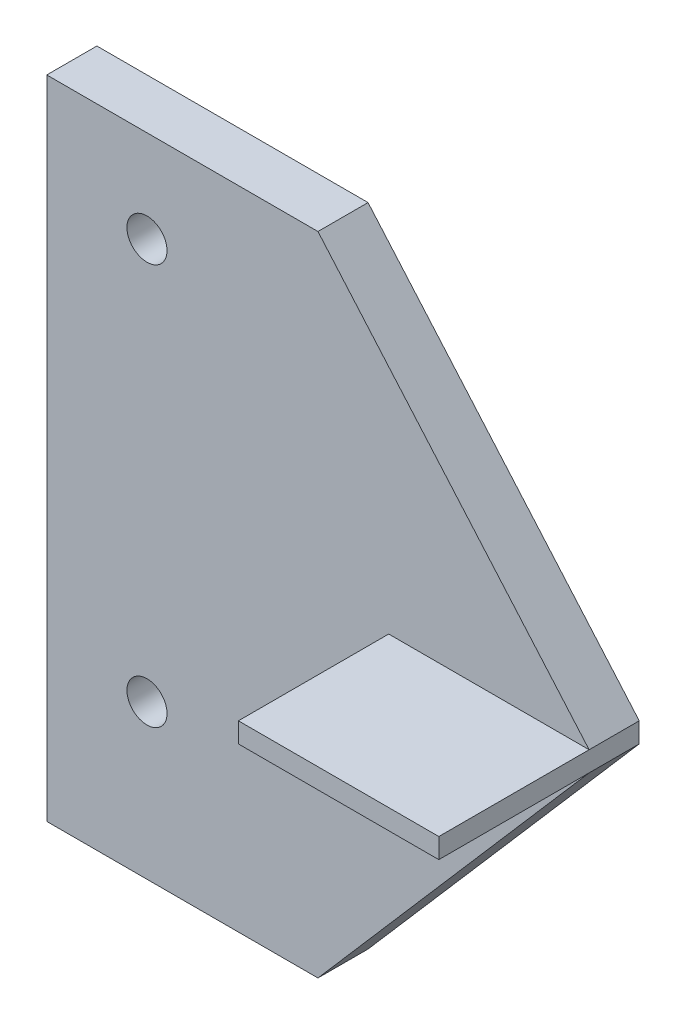
ISO-10303-21;
HEADER;
FILE_DESCRIPTION(('STEP AP214'),'2;1');
FILE_NAME('part.step','',(''),(''),'','','');
FILE_SCHEMA(('AUTOMOTIVE_DESIGN { 1 0 10303 214 1 1 1 1 }'));
ENDSEC;
DATA;
#1=APPLICATION_CONTEXT('core data for automotive mechanical design processes');
#2=APPLICATION_PROTOCOL_DEFINITION('international standard','automotive_design',2000,#1);
#3=PRODUCT_CONTEXT('',#1,'mechanical');
#4=PRODUCT('Part','Part','',(#3));
#5=PRODUCT_RELATED_PRODUCT_CATEGORY('part','',(#4));
#6=PRODUCT_DEFINITION_FORMATION('','',#4);
#7=PRODUCT_DEFINITION_CONTEXT('part definition',#1,'design');
#8=PRODUCT_DEFINITION('design','',#6,#7);
#9=PRODUCT_DEFINITION_SHAPE('','',#8);
#10=(LENGTH_UNIT() NAMED_UNIT(*) SI_UNIT(.MILLI.,.METRE.));
#11=(NAMED_UNIT(*) PLANE_ANGLE_UNIT() SI_UNIT($,.RADIAN.));
#12=(NAMED_UNIT(*) SI_UNIT($,.STERADIAN.) SOLID_ANGLE_UNIT());
#13=UNCERTAINTY_MEASURE_WITH_UNIT(LENGTH_MEASURE(1.E-05),#10,'distance_accuracy_value','');
#14=(GEOMETRIC_REPRESENTATION_CONTEXT(3) GLOBAL_UNCERTAINTY_ASSIGNED_CONTEXT((#13)) GLOBAL_UNIT_ASSIGNED_CONTEXT((#10,
#11,#12)) REPRESENTATION_CONTEXT('',''));
#15=CARTESIAN_POINT('',(0.,0.,0.));
#16=DIRECTION('',(0.,0.,1.));
#17=DIRECTION('',(1.,0.,0.));
#18=AXIS2_PLACEMENT_3D('',#15,#16,#17);
#19=CARTESIAN_POINT('',(0.,0.,5.));
#20=DIRECTION('',(0.,0.,1.));
#21=DIRECTION('',(1.,0.,0.));
#22=AXIS2_PLACEMENT_3D('',#19,#20,#21);
#23=PLANE('',#22);
#24=CARTESIAN_POINT('',(-310.2,-180.,5.));
#25=DIRECTION('',(0.,0.,1.));
#26=DIRECTION('',(1.,0.,0.));
#27=AXIS2_PLACEMENT_3D('',#24,#25,#26);
#28=CIRCLE('',#27,2.);
#29=CARTESIAN_POINT('',(-308.2,-180.,5.));
#30=VERTEX_POINT('',#29);
#31=EDGE_CURVE('E146',#30,#30,#28,.T.);
#32=ORIENTED_EDGE('',*,*,#31,.F.);
#33=EDGE_LOOP('',(#32));
#34=FACE_BOUND('',#33,.T.);
#35=CARTESIAN_POINT('',(-310.2,-220.,5.));
#36=DIRECTION('',(0.,0.,1.));
#37=DIRECTION('',(1.,0.,0.));
#38=AXIS2_PLACEMENT_3D('',#35,#36,#37);
#39=CIRCLE('',#38,2.);
#40=CARTESIAN_POINT('',(-308.2,-220.,5.));
#41=VERTEX_POINT('',#40);
#42=EDGE_CURVE('E225',#41,#41,#39,.T.);
#43=ORIENTED_EDGE('',*,*,#42,.F.);
#44=EDGE_LOOP('',(#43));
#45=FACE_BOUND('',#44,.T.);
#46=DIRECTION('',(1.,0.,0.));
#47=VECTOR('',#46,1.);
#48=CARTESIAN_POINT('',(-320.2,-235.332908159876,5.));
#49=LINE('',#48,#47);
#50=CARTESIAN_POINT('',(-320.2,-235.332908159876,5.));
#51=VERTEX_POINT('',#50);
#52=CARTESIAN_POINT('',(-293.137631361917,-235.332908159876,5.));
#53=VERTEX_POINT('',#52);
#54=EDGE_CURVE('E123',#51,#53,#49,.T.);
#55=ORIENTED_EDGE('',*,*,#54,.T.);
#56=DIRECTION('',(0.654522827141133,0.756042240057511,0.));
#57=VECTOR('',#56,1.);
#58=CARTESIAN_POINT('',(-51.1036705060079,44.2416006998985,5.));
#59=LINE('',#58,#57);
#60=CARTESIAN_POINT('',(-266.075262723834,-204.07304531328,5.));
#61=VERTEX_POINT('',#60);
#62=EDGE_CURVE('E109',#53,#61,#59,.T.);
#63=ORIENTED_EDGE('',*,*,#62,.T.);
#64=DIRECTION('',(1.,0.,0.));
#65=VECTOR('',#64,1.);
#66=CARTESIAN_POINT('',(0.,-204.07304531328,5.));
#67=LINE('',#66,#65);
#68=CARTESIAN_POINT('',(-286.075262723834,-204.07304531328,5.));
#69=VERTEX_POINT('',#68);
#70=EDGE_CURVE('E218',#69,#61,#67,.T.);
#71=ORIENTED_EDGE('',*,*,#70,.F.);
#72=DIRECTION('',(0.,1.,0.));
#73=VECTOR('',#72,1.);
#74=CARTESIAN_POINT('',(-286.075262723834,0.,5.));
#75=LINE('',#74,#73);
#76=CARTESIAN_POINT('',(-286.075262723834,-202.07304531328,5.));
#77=VERTEX_POINT('',#76);
#78=EDGE_CURVE('E221',#69,#77,#75,.T.);
#79=ORIENTED_EDGE('',*,*,#78,.T.);
#80=DIRECTION('',(-1.,0.,0.));
#81=VECTOR('',#80,1.);
#82=CARTESIAN_POINT('',(0.,-202.07304531328,5.));
#83=LINE('',#82,#81);
#84=CARTESIAN_POINT('',(-266.075262723834,-202.07304531328,5.));
#85=VERTEX_POINT('',#84);
#86=EDGE_CURVE('E171',#85,#77,#83,.T.);
#87=ORIENTED_EDGE('',*,*,#86,.F.);
#88=DIRECTION('',(-0.654522827141133,0.75604224005751,0.));
#89=VECTOR('',#88,1.);
#90=CARTESIAN_POINT('',(-252.083806186949,-218.234639230512,5.));
#91=LINE('',#90,#89);
#92=CARTESIAN_POINT('',(-293.137631361917,-170.813182466683,5.));
#93=VERTEX_POINT('',#92);
#94=EDGE_CURVE('E163',#85,#93,#91,.T.);
#95=ORIENTED_EDGE('',*,*,#94,.T.);
#96=DIRECTION('',(-1.,0.,0.));
#97=VECTOR('',#96,1.);
#98=CARTESIAN_POINT('',(-320.2,-170.813182466683,5.));
#99=LINE('',#98,#97);
#100=CARTESIAN_POINT('',(-320.2,-170.813182466683,5.));
#101=VERTEX_POINT('',#100);
#102=EDGE_CURVE('E132',#93,#101,#99,.T.);
#103=ORIENTED_EDGE('',*,*,#102,.T.);
#104=DIRECTION('',(0.,-1.,0.));
#105=VECTOR('',#104,1.);
#106=CARTESIAN_POINT('',(-320.2,-170.813182466683,5.));
#107=LINE('',#106,#105);
#108=EDGE_CURVE('E129',#101,#51,#107,.T.);
#109=ORIENTED_EDGE('',*,*,#108,.T.);
#110=EDGE_LOOP('',(#55,#63,#71,#79,#87,#95,#103,#109));
#111=FACE_BOUND('',#110,.T.);
#112=ADVANCED_FACE('F40',(#34,#45,#111),#23,.T.);
#113=CARTESIAN_POINT('',(0.,0.,0.));
#114=DIRECTION('',(0.,0.,1.));
#115=DIRECTION('',(1.,0.,0.));
#116=AXIS2_PLACEMENT_3D('',#113,#114,#115);
#117=PLANE('',#116);
#118=CARTESIAN_POINT('',(-310.2,-180.,0.));
#119=DIRECTION('',(0.,0.,1.));
#120=DIRECTION('',(1.,0.,0.));
#121=AXIS2_PLACEMENT_3D('',#118,#119,#120);
#122=CIRCLE('',#121,2.);
#123=CARTESIAN_POINT('',(-308.2,-180.,0.));
#124=VERTEX_POINT('',#123);
#125=EDGE_CURVE('E229',#124,#124,#122,.T.);
#126=ORIENTED_EDGE('',*,*,#125,.T.);
#127=EDGE_LOOP('',(#126));
#128=FACE_BOUND('',#127,.T.);
#129=CARTESIAN_POINT('',(-310.2,-220.,0.));
#130=DIRECTION('',(0.,0.,1.));
#131=DIRECTION('',(1.,0.,0.));
#132=AXIS2_PLACEMENT_3D('',#129,#130,#131);
#133=CIRCLE('',#132,2.);
#134=CARTESIAN_POINT('',(-308.2,-220.,0.));
#135=VERTEX_POINT('',#134);
#136=EDGE_CURVE('E224',#135,#135,#133,.T.);
#137=ORIENTED_EDGE('',*,*,#136,.T.);
#138=EDGE_LOOP('',(#137));
#139=FACE_BOUND('',#138,.T.);
#140=DIRECTION('',(0.654522827141133,0.756042240057511,0.));
#141=VECTOR('',#140,1.);
#142=CARTESIAN_POINT('',(-51.1036705060079,44.2416006998985,0.));
#143=LINE('',#142,#141);
#144=CARTESIAN_POINT('',(-293.137631361917,-235.332908159876,0.));
#145=VERTEX_POINT('',#144);
#146=CARTESIAN_POINT('',(-266.075262723834,-204.07304531328,0.));
#147=VERTEX_POINT('',#146);
#148=EDGE_CURVE('E55',#145,#147,#143,.T.);
#149=ORIENTED_EDGE('',*,*,#148,.F.);
#150=DIRECTION('',(1.,0.,0.));
#151=VECTOR('',#150,1.);
#152=CARTESIAN_POINT('',(-320.2,-235.332908159876,0.));
#153=LINE('',#152,#151);
#154=CARTESIAN_POINT('',(-320.2,-235.332908159876,0.));
#155=VERTEX_POINT('',#154);
#156=EDGE_CURVE('E125',#155,#145,#153,.T.);
#157=ORIENTED_EDGE('',*,*,#156,.F.);
#158=DIRECTION('',(0.,-1.,0.));
#159=VECTOR('',#158,1.);
#160=CARTESIAN_POINT('',(-320.2,-170.813182466683,0.));
#161=LINE('',#160,#159);
#162=CARTESIAN_POINT('',(-320.2,-170.813182466683,0.));
#163=VERTEX_POINT('',#162);
#164=EDGE_CURVE('E142',#163,#155,#161,.T.);
#165=ORIENTED_EDGE('',*,*,#164,.F.);
#166=DIRECTION('',(-1.,0.,0.));
#167=VECTOR('',#166,1.);
#168=CARTESIAN_POINT('',(-320.2,-170.813182466683,0.));
#169=LINE('',#168,#167);
#170=CARTESIAN_POINT('',(-293.137631361917,-170.813182466683,0.));
#171=VERTEX_POINT('',#170);
#172=EDGE_CURVE('E138',#171,#163,#169,.T.);
#173=ORIENTED_EDGE('',*,*,#172,.F.);
#174=DIRECTION('',(-0.654522827141133,0.75604224005751,0.));
#175=VECTOR('',#174,1.);
#176=CARTESIAN_POINT('',(-252.083806186949,-218.234639230512,0.));
#177=LINE('',#176,#175);
#178=CARTESIAN_POINT('',(-266.075262723834,-202.07304531328,0.));
#179=VERTEX_POINT('',#178);
#180=EDGE_CURVE('E63',#179,#171,#177,.T.);
#181=ORIENTED_EDGE('',*,*,#180,.F.);
#182=DIRECTION('',(0.,1.,0.));
#183=VECTOR('',#182,1.);
#184=CARTESIAN_POINT('',(-266.075262723834,-170.813182466683,0.));
#185=LINE('',#184,#183);
#186=EDGE_CURVE('E149',#147,#179,#185,.T.);
#187=ORIENTED_EDGE('',*,*,#186,.F.);
#188=EDGE_LOOP('',(#149,#157,#165,#173,#181,#187));
#189=FACE_BOUND('',#188,.T.);
#190=ADVANCED_FACE('F179',(#128,#139,#189),#117,.F.);
#191=CARTESIAN_POINT('',(-320.2,-235.332908159876,5.));
#192=DIRECTION('',(0.,1.,0.));
#193=DIRECTION('',(0.,0.,1.));
#194=AXIS2_PLACEMENT_3D('',#191,#192,#193);
#195=PLANE('',#194);
#196=DIRECTION('',(0.,0.,1.));
#197=VECTOR('',#196,1.);
#198=CARTESIAN_POINT('',(-293.137631361917,-235.332908159876,-2.));
#199=LINE('',#198,#197);
#200=EDGE_CURVE('E112',#145,#53,#199,.T.);
#201=ORIENTED_EDGE('',*,*,#200,.T.);
#202=ORIENTED_EDGE('',*,*,#54,.F.);
#203=DIRECTION('',(0.,0.,-1.));
#204=VECTOR('',#203,1.);
#205=CARTESIAN_POINT('',(-320.2,-235.332908159876,5.));
#206=LINE('',#205,#204);
#207=EDGE_CURVE('E158',#51,#155,#206,.T.);
#208=ORIENTED_EDGE('',*,*,#207,.T.);
#209=ORIENTED_EDGE('',*,*,#156,.T.);
#210=EDGE_LOOP('',(#201,#202,#208,#209));
#211=FACE_BOUND('',#210,.T.);
#212=ADVANCED_FACE('F121',(#211),#195,.F.);
#213=CARTESIAN_POINT('',(-266.075262723834,-170.813182466683,5.));
#214=DIRECTION('',(-1.,0.,0.));
#215=DIRECTION('',(0.,0.,1.));
#216=AXIS2_PLACEMENT_3D('',#213,#214,#215);
#217=PLANE('',#216);
#218=DIRECTION('',(0.,0.,1.));
#219=VECTOR('',#218,1.);
#220=CARTESIAN_POINT('',(-266.075262723834,-204.07304531328,5.));
#221=LINE('',#220,#219);
#222=EDGE_CURVE('E12',#147,#61,#221,.T.);
#223=ORIENTED_EDGE('',*,*,#222,.F.);
#224=ORIENTED_EDGE('',*,*,#186,.T.);
#225=DIRECTION('',(0.,0.,1.));
#226=VECTOR('',#225,1.);
#227=CARTESIAN_POINT('',(-266.075262723834,-202.07304531328,-2.));
#228=LINE('',#227,#226);
#229=EDGE_CURVE('E117',#179,#85,#228,.T.);
#230=ORIENTED_EDGE('',*,*,#229,.T.);
#231=DIRECTION('',(0.,0.,1.));
#232=VECTOR('',#231,1.);
#233=CARTESIAN_POINT('',(-266.075262723834,-202.07304531328,0.));
#234=LINE('',#233,#232);
#235=CARTESIAN_POINT('',(-266.075262723834,-202.07304531328,20.));
#236=VERTEX_POINT('',#235);
#237=EDGE_CURVE('E182',#85,#236,#234,.T.);
#238=ORIENTED_EDGE('',*,*,#237,.T.);
#239=DIRECTION('',(0.,-1.,0.));
#240=VECTOR('',#239,1.);
#241=CARTESIAN_POINT('',(-266.075262723834,-204.07304531328,20.));
#242=LINE('',#241,#240);
#243=CARTESIAN_POINT('',(-266.075262723834,-204.07304531328,20.));
#244=VERTEX_POINT('',#243);
#245=EDGE_CURVE('E186',#236,#244,#242,.T.);
#246=ORIENTED_EDGE('',*,*,#245,.T.);
#247=DIRECTION('',(0.,0.,-1.));
#248=VECTOR('',#247,1.);
#249=CARTESIAN_POINT('',(-266.075262723834,-204.07304531328,0.));
#250=LINE('',#249,#248);
#251=EDGE_CURVE('E195',#244,#61,#250,.T.);
#252=ORIENTED_EDGE('',*,*,#251,.T.);
#253=EDGE_LOOP('',(#223,#224,#230,#238,#246,#252));
#254=FACE_BOUND('',#253,.T.);
#255=ADVANCED_FACE('F265',(#254),#217,.F.);
#256=CARTESIAN_POINT('',(-320.2,-170.813182466683,5.));
#257=DIRECTION('',(0.,-1.,0.));
#258=DIRECTION('',(0.,0.,-1.));
#259=AXIS2_PLACEMENT_3D('',#256,#257,#258);
#260=PLANE('',#259);
#261=DIRECTION('',(0.,0.,1.));
#262=VECTOR('',#261,1.);
#263=CARTESIAN_POINT('',(-293.137631361917,-170.813182466683,5.));
#264=LINE('',#263,#262);
#265=EDGE_CURVE('E49',#171,#93,#264,.T.);
#266=ORIENTED_EDGE('',*,*,#265,.F.);
#267=ORIENTED_EDGE('',*,*,#172,.T.);
#268=DIRECTION('',(0.,0.,-1.));
#269=VECTOR('',#268,1.);
#270=CARTESIAN_POINT('',(-320.2,-170.813182466683,5.));
#271=LINE('',#270,#269);
#272=EDGE_CURVE('E136',#101,#163,#271,.T.);
#273=ORIENTED_EDGE('',*,*,#272,.F.);
#274=ORIENTED_EDGE('',*,*,#102,.F.);
#275=EDGE_LOOP('',(#266,#267,#273,#274));
#276=FACE_BOUND('',#275,.T.);
#277=ADVANCED_FACE('F175',(#276),#260,.F.);
#278=CARTESIAN_POINT('',(-320.2,-170.813182466683,5.));
#279=DIRECTION('',(1.,0.,0.));
#280=DIRECTION('',(0.,0.,-1.));
#281=AXIS2_PLACEMENT_3D('',#278,#279,#280);
#282=PLANE('',#281);
#283=ORIENTED_EDGE('',*,*,#164,.T.);
#284=ORIENTED_EDGE('',*,*,#207,.F.);
#285=ORIENTED_EDGE('',*,*,#108,.F.);
#286=ORIENTED_EDGE('',*,*,#272,.T.);
#287=EDGE_LOOP('',(#283,#284,#285,#286));
#288=FACE_BOUND('',#287,.T.);
#289=ADVANCED_FACE('F42',(#288),#282,.F.);
#290=CARTESIAN_POINT('',(-310.2,-180.,5.));
#291=DIRECTION('',(0.,0.,-1.));
#292=DIRECTION('',(-1.,0.,0.));
#293=AXIS2_PLACEMENT_3D('',#290,#291,#292);
#294=CYLINDRICAL_SURFACE('',#293,2.);
#295=ORIENTED_EDGE('',*,*,#31,.T.);
#296=EDGE_LOOP('',(#295));
#297=FACE_BOUND('',#296,.T.);
#298=ORIENTED_EDGE('',*,*,#125,.F.);
#299=EDGE_LOOP('',(#298));
#300=FACE_BOUND('',#299,.T.);
#301=ADVANCED_FACE('F241',(#297,#300),#294,.F.);
#302=CARTESIAN_POINT('',(-310.2,-220.,5.));
#303=DIRECTION('',(0.,0.,-1.));
#304=DIRECTION('',(-1.,0.,0.));
#305=AXIS2_PLACEMENT_3D('',#302,#303,#304);
#306=CYLINDRICAL_SURFACE('',#305,2.);
#307=ORIENTED_EDGE('',*,*,#42,.T.);
#308=EDGE_LOOP('',(#307));
#309=FACE_BOUND('',#308,.T.);
#310=ORIENTED_EDGE('',*,*,#136,.F.);
#311=EDGE_LOOP('',(#310));
#312=FACE_BOUND('',#311,.T.);
#313=ADVANCED_FACE('F243',(#309,#312),#306,.F.);
#314=CARTESIAN_POINT('',(-286.075262723834,-204.07304531328,0.));
#315=DIRECTION('',(0.,-1.,0.));
#316=DIRECTION('',(0.,0.,-1.));
#317=AXIS2_PLACEMENT_3D('',#314,#315,#316);
#318=PLANE('',#317);
#319=DIRECTION('',(0.,0.,-1.));
#320=VECTOR('',#319,1.);
#321=CARTESIAN_POINT('',(-286.075262723834,-204.07304531328,0.));
#322=LINE('',#321,#320);
#323=CARTESIAN_POINT('',(-286.075262723834,-204.07304531328,20.));
#324=VERTEX_POINT('',#323);
#325=EDGE_CURVE('E199',#324,#69,#322,.T.);
#326=ORIENTED_EDGE('',*,*,#325,.T.);
#327=ORIENTED_EDGE('',*,*,#70,.T.);
#328=ORIENTED_EDGE('',*,*,#251,.F.);
#329=DIRECTION('',(1.,0.,0.));
#330=VECTOR('',#329,1.);
#331=CARTESIAN_POINT('',(-286.075262723834,-204.07304531328,20.));
#332=LINE('',#331,#330);
#333=EDGE_CURVE('E210',#324,#244,#332,.T.);
#334=ORIENTED_EDGE('',*,*,#333,.F.);
#335=EDGE_LOOP('',(#326,#327,#328,#334));
#336=FACE_BOUND('',#335,.T.);
#337=ADVANCED_FACE('F250',(#336),#318,.T.);
#338=CARTESIAN_POINT('',(-286.075262723834,-204.07304531328,20.));
#339=DIRECTION('',(0.,0.,1.));
#340=DIRECTION('',(1.,0.,0.));
#341=AXIS2_PLACEMENT_3D('',#338,#339,#340);
#342=PLANE('',#341);
#343=ORIENTED_EDGE('',*,*,#245,.F.);
#344=DIRECTION('',(1.,0.,0.));
#345=VECTOR('',#344,1.);
#346=CARTESIAN_POINT('',(-286.075262723834,-202.07304531328,20.));
#347=LINE('',#346,#345);
#348=CARTESIAN_POINT('',(-286.075262723834,-202.07304531328,20.));
#349=VERTEX_POINT('',#348);
#350=EDGE_CURVE('E202',#349,#236,#347,.T.);
#351=ORIENTED_EDGE('',*,*,#350,.F.);
#352=DIRECTION('',(0.,-1.,0.));
#353=VECTOR('',#352,1.);
#354=CARTESIAN_POINT('',(-286.075262723834,-204.07304531328,20.));
#355=LINE('',#354,#353);
#356=EDGE_CURVE('E194',#349,#324,#355,.T.);
#357=ORIENTED_EDGE('',*,*,#356,.T.);
#358=ORIENTED_EDGE('',*,*,#333,.T.);
#359=EDGE_LOOP('',(#343,#351,#357,#358));
#360=FACE_BOUND('',#359,.T.);
#361=ADVANCED_FACE('F303',(#360),#342,.T.);
#362=CARTESIAN_POINT('',(-286.075262723834,-202.07304531328,0.));
#363=DIRECTION('',(0.,1.,0.));
#364=DIRECTION('',(0.,0.,1.));
#365=AXIS2_PLACEMENT_3D('',#362,#363,#364);
#366=PLANE('',#365);
#367=ORIENTED_EDGE('',*,*,#237,.F.);
#368=ORIENTED_EDGE('',*,*,#86,.T.);
#369=DIRECTION('',(0.,0.,1.));
#370=VECTOR('',#369,1.);
#371=CARTESIAN_POINT('',(-286.075262723834,-202.07304531328,0.));
#372=LINE('',#371,#370);
#373=EDGE_CURVE('E191',#77,#349,#372,.T.);
#374=ORIENTED_EDGE('',*,*,#373,.T.);
#375=ORIENTED_EDGE('',*,*,#350,.T.);
#376=EDGE_LOOP('',(#367,#368,#374,#375));
#377=FACE_BOUND('',#376,.T.);
#378=ADVANCED_FACE('F308',(#377),#366,.T.);
#379=CARTESIAN_POINT('',(-286.075262723834,0.,0.));
#380=DIRECTION('',(1.,0.,0.));
#381=DIRECTION('',(0.,0.,-1.));
#382=AXIS2_PLACEMENT_3D('',#379,#380,#381);
#383=PLANE('',#382);
#384=ORIENTED_EDGE('',*,*,#78,.F.);
#385=ORIENTED_EDGE('',*,*,#325,.F.);
#386=ORIENTED_EDGE('',*,*,#356,.F.);
#387=ORIENTED_EDGE('',*,*,#373,.F.);
#388=EDGE_LOOP('',(#384,#385,#386,#387));
#389=FACE_BOUND('',#388,.T.);
#390=ADVANCED_FACE('F316',(#389),#383,.F.);
#391=CARTESIAN_POINT('',(-252.083806186949,-218.234639230512,-2.));
#392=DIRECTION('',(0.75604224005751,0.654522827141133,0.));
#393=DIRECTION('',(-0.654522827141133,0.75604224005751,0.));
#394=AXIS2_PLACEMENT_3D('',#391,#392,#393);
#395=PLANE('',#394);
#396=ORIENTED_EDGE('',*,*,#180,.T.);
#397=ORIENTED_EDGE('',*,*,#265,.T.);
#398=ORIENTED_EDGE('',*,*,#94,.F.);
#399=ORIENTED_EDGE('',*,*,#229,.F.);
#400=EDGE_LOOP('',(#396,#397,#398,#399));
#401=FACE_BOUND('',#400,.T.);
#402=ADVANCED_FACE('F162',(#401),#395,.T.);
#403=CARTESIAN_POINT('',(-51.1036705060079,44.2416006998985,-2.));
#404=DIRECTION('',(0.756042240057511,-0.654522827141133,0.));
#405=DIRECTION('',(0.654522827141133,0.756042240057511,0.));
#406=AXIS2_PLACEMENT_3D('',#403,#404,#405);
#407=PLANE('',#406);
#408=ORIENTED_EDGE('',*,*,#148,.T.);
#409=ORIENTED_EDGE('',*,*,#222,.T.);
#410=ORIENTED_EDGE('',*,*,#62,.F.);
#411=ORIENTED_EDGE('',*,*,#200,.F.);
#412=EDGE_LOOP('',(#408,#409,#410,#411));
#413=FACE_BOUND('',#412,.T.);
#414=ADVANCED_FACE('F111',(#413),#407,.T.);
#415=CLOSED_SHELL('',(#112,#190,#212,#255,#277,#289,#301,#313,#337,#361,#378,#390,#402,#414));
#416=MANIFOLD_SOLID_BREP('B2',#415);
#417=ADVANCED_BREP_SHAPE_REPRESENTATION('',(#18,#416),#14);
#418=SHAPE_DEFINITION_REPRESENTATION(#9,#417);
ENDSEC;
END-ISO-10303-21;
